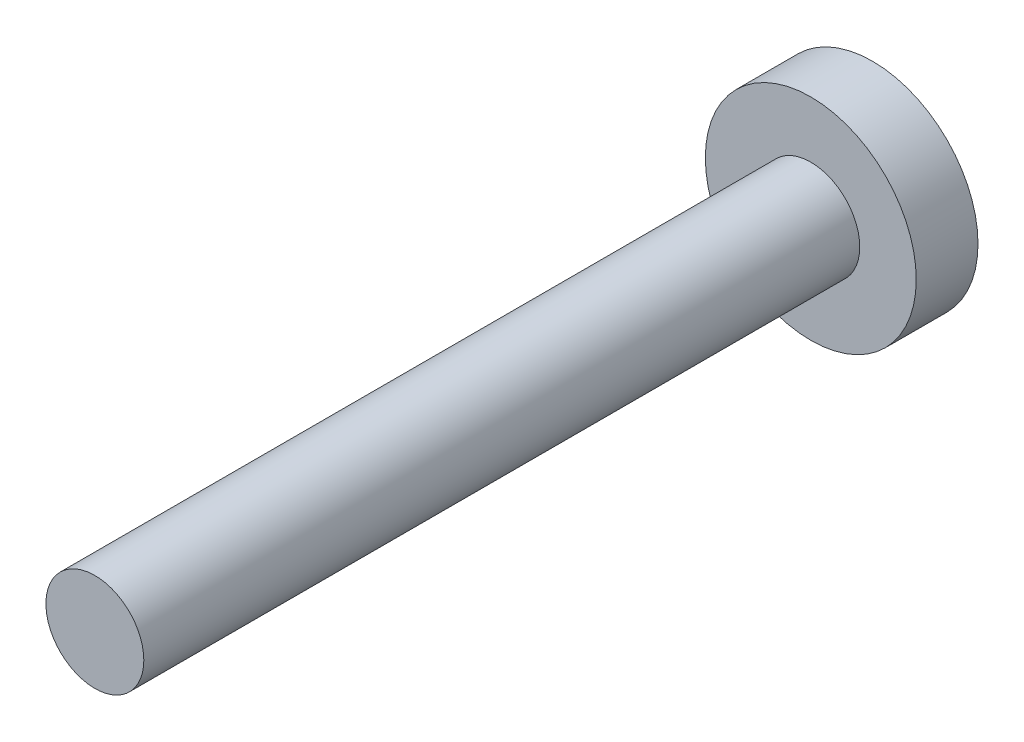
ISO-10303-21;
HEADER;
FILE_DESCRIPTION(('STEP AP214'),'2;1');
FILE_NAME('part.step','',(''),(''),'','','');
FILE_SCHEMA(('AUTOMOTIVE_DESIGN { 1 0 10303 214 1 1 1 1 }'));
ENDSEC;
DATA;
#1=APPLICATION_CONTEXT('core data for automotive mechanical design processes');
#2=APPLICATION_PROTOCOL_DEFINITION('international standard','automotive_design',2000,#1);
#3=PRODUCT_CONTEXT('',#1,'mechanical');
#4=PRODUCT('Part','Part','',(#3));
#5=PRODUCT_RELATED_PRODUCT_CATEGORY('part','',(#4));
#6=PRODUCT_DEFINITION_FORMATION('','',#4);
#7=PRODUCT_DEFINITION_CONTEXT('part definition',#1,'design');
#8=PRODUCT_DEFINITION('design','',#6,#7);
#9=PRODUCT_DEFINITION_SHAPE('','',#8);
#10=(LENGTH_UNIT() NAMED_UNIT(*) SI_UNIT(.MILLI.,.METRE.));
#11=(NAMED_UNIT(*) PLANE_ANGLE_UNIT() SI_UNIT($,.RADIAN.));
#12=(NAMED_UNIT(*) SI_UNIT($,.STERADIAN.) SOLID_ANGLE_UNIT());
#13=UNCERTAINTY_MEASURE_WITH_UNIT(LENGTH_MEASURE(1.E-05),#10,'distance_accuracy_value','');
#14=(GEOMETRIC_REPRESENTATION_CONTEXT(3) GLOBAL_UNCERTAINTY_ASSIGNED_CONTEXT((#13)) GLOBAL_UNIT_ASSIGNED_CONTEXT((#10,
#11,#12)) REPRESENTATION_CONTEXT('',''));
#15=CARTESIAN_POINT('',(0.,0.,0.));
#16=DIRECTION('',(0.,0.,1.));
#17=DIRECTION('',(1.,0.,0.));
#18=AXIS2_PLACEMENT_3D('',#15,#16,#17);
#19=CARTESIAN_POINT('',(0.,0.,3.58));
#20=DIRECTION('',(0.,0.,-1.));
#21=DIRECTION('',(-1.,0.,0.));
#22=AXIS2_PLACEMENT_3D('',#19,#20,#21);
#23=CYLINDRICAL_SURFACE('',#22,6.1125);
#24=CARTESIAN_POINT('',(0.,0.,3.58));
#25=DIRECTION('',(0.,0.,1.));
#26=DIRECTION('',(1.,0.,0.));
#27=AXIS2_PLACEMENT_3D('',#24,#25,#26);
#28=CIRCLE('',#27,6.1125);
#29=CARTESIAN_POINT('',(-6.1125,0.,3.58));
#30=VERTEX_POINT('',#29);
#31=EDGE_CURVE('E51',#30,#30,#28,.T.);
#32=CARTESIAN_POINT('',(0.,0.,0.));
#33=DIRECTION('',(0.,0.,1.));
#34=DIRECTION('',(1.,0.,0.));
#35=AXIS2_PLACEMENT_3D('',#32,#33,#34);
#36=CIRCLE('',#35,6.1125);
#37=CARTESIAN_POINT('',(-6.1125,0.,0.));
#38=VERTEX_POINT('',#37);
#39=EDGE_CURVE('E46',#38,#38,#36,.T.);
#40=CARTESIAN_POINT('',(-6.1125,0.,3.58));
#41=CARTESIAN_POINT('',(-6.1125,0.,3.54270833333333));
#42=CARTESIAN_POINT('',(-6.1125,0.,3.50541666666667));
#43=CARTESIAN_POINT('',(-6.1125,0.,3.43083333333333));
#44=CARTESIAN_POINT('',(-6.1125,0.,3.39354166666667));
#45=CARTESIAN_POINT('',(-6.1125,0.,3.31895833333333));
#46=CARTESIAN_POINT('',(-6.1125,0.,3.28166666666667));
#47=CARTESIAN_POINT('',(-6.1125,0.,3.20708333333333));
#48=CARTESIAN_POINT('',(-6.1125,0.,3.16979166666667));
#49=CARTESIAN_POINT('',(-6.1125,0.,3.09520833333333));
#50=CARTESIAN_POINT('',(-6.1125,0.,3.05791666666667));
#51=CARTESIAN_POINT('',(-6.1125,0.,2.98333333333333));
#52=CARTESIAN_POINT('',(-6.1125,0.,2.94604166666667));
#53=CARTESIAN_POINT('',(-6.1125,0.,2.87145833333333));
#54=CARTESIAN_POINT('',(-6.1125,0.,2.83416666666667));
#55=CARTESIAN_POINT('',(-6.1125,0.,2.75958333333333));
#56=CARTESIAN_POINT('',(-6.1125,0.,2.72229166666667));
#57=CARTESIAN_POINT('',(-6.1125,0.,2.64770833333333));
#58=CARTESIAN_POINT('',(-6.1125,0.,2.61041666666667));
#59=CARTESIAN_POINT('',(-6.1125,0.,2.53583333333333));
#60=CARTESIAN_POINT('',(-6.1125,0.,2.49854166666667));
#61=CARTESIAN_POINT('',(-6.1125,0.,2.42395833333333));
#62=CARTESIAN_POINT('',(-6.1125,0.,2.38666666666667));
#63=CARTESIAN_POINT('',(-6.1125,0.,2.31208333333333));
#64=CARTESIAN_POINT('',(-6.1125,0.,2.27479166666667));
#65=CARTESIAN_POINT('',(-6.1125,0.,2.20020833333333));
#66=CARTESIAN_POINT('',(-6.1125,0.,2.16291666666667));
#67=CARTESIAN_POINT('',(-6.1125,0.,2.08833333333333));
#68=CARTESIAN_POINT('',(-6.1125,0.,2.05104166666667));
#69=CARTESIAN_POINT('',(-6.1125,0.,1.97645833333333));
#70=CARTESIAN_POINT('',(-6.1125,0.,1.93916666666667));
#71=CARTESIAN_POINT('',(-6.1125,0.,1.86458333333333));
#72=CARTESIAN_POINT('',(-6.1125,0.,1.82729166666667));
#73=CARTESIAN_POINT('',(-6.1125,0.,1.75270833333333));
#74=CARTESIAN_POINT('',(-6.1125,0.,1.71541666666667));
#75=CARTESIAN_POINT('',(-6.1125,0.,1.64083333333333));
#76=CARTESIAN_POINT('',(-6.1125,0.,1.60354166666667));
#77=CARTESIAN_POINT('',(-6.1125,0.,1.52895833333333));
#78=CARTESIAN_POINT('',(-6.1125,0.,1.49166666666667));
#79=CARTESIAN_POINT('',(-6.1125,0.,1.41708333333333));
#80=CARTESIAN_POINT('',(-6.1125,0.,1.37979166666667));
#81=CARTESIAN_POINT('',(-6.1125,0.,1.30520833333333));
#82=CARTESIAN_POINT('',(-6.1125,0.,1.26791666666667));
#83=CARTESIAN_POINT('',(-6.1125,0.,1.19333333333333));
#84=CARTESIAN_POINT('',(-6.1125,0.,1.15604166666667));
#85=CARTESIAN_POINT('',(-6.1125,0.,1.08145833333333));
#86=CARTESIAN_POINT('',(-6.1125,0.,1.04416666666667));
#87=CARTESIAN_POINT('',(-6.1125,0.,0.969583333333334));
#88=CARTESIAN_POINT('',(-6.1125,0.,0.932291666666667));
#89=CARTESIAN_POINT('',(-6.1125,0.,0.857708333333333));
#90=CARTESIAN_POINT('',(-6.1125,0.,0.820416666666667));
#91=CARTESIAN_POINT('',(-6.1125,0.,0.745833333333333));
#92=CARTESIAN_POINT('',(-6.1125,0.,0.708541666666667));
#93=CARTESIAN_POINT('',(-6.1125,0.,0.633958333333333));
#94=CARTESIAN_POINT('',(-6.1125,0.,0.596666666666667));
#95=CARTESIAN_POINT('',(-6.1125,0.,0.522083333333333));
#96=CARTESIAN_POINT('',(-6.1125,0.,0.484791666666667));
#97=CARTESIAN_POINT('',(-6.1125,0.,0.410208333333333));
#98=CARTESIAN_POINT('',(-6.1125,0.,0.372916666666667));
#99=CARTESIAN_POINT('',(-6.1125,0.,0.298333333333333));
#100=CARTESIAN_POINT('',(-6.1125,0.,0.261041666666667));
#101=CARTESIAN_POINT('',(-6.1125,0.,0.186458333333333));
#102=CARTESIAN_POINT('',(-6.1125,0.,0.149166666666667));
#103=CARTESIAN_POINT('',(-6.1125,0.,0.0745833333333333));
#104=CARTESIAN_POINT('',(-6.1125,0.,0.0372916666666667));
#105=CARTESIAN_POINT('',(-6.1125,0.,0.));
#106=B_SPLINE_CURVE_WITH_KNOTS('',3,(#40,#41,#42,#43,#44,#45,#46,#47,#48,#49,#50,#51,#52,#53,
#54,#55,#56,#57,#58,#59,#60,#61,#62,#63,#64,#65,#66,#67,#68,#69,#70,#71,#72,#73,#74,#75,#76,#77,
#78,#79,#80,#81,#82,#83,#84,#85,#86,#87,#88,#89,#90,#91,#92,#93,#94,#95,#96,#97,#98,#99,#100,
#101,#102,#103,#104,#105),.UNSPECIFIED.,.F.,.F.,(4,2,2,2,2,2,2,2,2,2,2,2,2,2,2,2,2,2,2,2,2,2,2,
2,2,2,2,2,2,2,2,2,4),(0.,0.111875,0.22375,0.335625,0.4475,0.559375,0.67125,0.783125,0.895,
1.006875,1.11875,1.230625,1.3425,1.454375,1.56625,1.678125,1.79,1.901875,2.01375,2.125625,
2.2375,2.349375,2.46125,2.573125,2.685,2.796875,2.90875,3.020625,3.1325,3.244375,3.35625,
3.468125,3.58),.UNSPECIFIED.);
#107=EDGE_CURVE('BSEAM43',#30,#38,#106,.T.);
#108=ORIENTED_EDGE('',*,*,#31,.F.);
#109=ORIENTED_EDGE('',*,*,#39,.T.);
#110=ORIENTED_EDGE('',*,*,#107,.T.);
#111=ORIENTED_EDGE('',*,*,#107,.F.);
#112=EDGE_LOOP('',(#108,#110,#109,#111));
#113=FACE_BOUND('',#112,.T.);
#114=ADVANCED_FACE('F43',(#113),#23,.T.);
#115=CARTESIAN_POINT('',(0.,0.,3.58));
#116=DIRECTION('',(0.,0.,1.));
#117=DIRECTION('',(1.,0.,0.));
#118=AXIS2_PLACEMENT_3D('',#115,#116,#117);
#119=PLANE('',#118);
#120=CARTESIAN_POINT('',(0.,0.,3.58));
#121=DIRECTION('',(0.,0.,1.));
#122=DIRECTION('',(1.,0.,0.));
#123=AXIS2_PLACEMENT_3D('',#120,#121,#122);
#124=CIRCLE('',#123,2.8375);
#125=CARTESIAN_POINT('',(2.8375,0.,3.58));
#126=VERTEX_POINT('',#125);
#127=EDGE_CURVE('E10',#126,#126,#124,.T.);
#128=ORIENTED_EDGE('',*,*,#127,.F.);
#129=EDGE_LOOP('',(#128));
#130=FACE_BOUND('',#129,.T.);
#131=ORIENTED_EDGE('',*,*,#31,.T.);
#132=EDGE_LOOP('',(#131));
#133=FACE_BOUND('',#132,.T.);
#134=ADVANCED_FACE('F71',(#130,#133),#119,.T.);
#135=CARTESIAN_POINT('',(0.,0.,0.));
#136=DIRECTION('',(0.,0.,1.));
#137=DIRECTION('',(1.,0.,0.));
#138=AXIS2_PLACEMENT_3D('',#135,#136,#137);
#139=PLANE('',#138);
#140=ORIENTED_EDGE('',*,*,#39,.F.);
#141=EDGE_LOOP('',(#140));
#142=FACE_BOUND('',#141,.T.);
#143=ADVANCED_FACE('F68',(#142),#139,.F.);
#144=CARTESIAN_POINT('',(0.,0.,45.08));
#145=DIRECTION('',(0.,0.,-1.));
#146=DIRECTION('',(-1.,0.,0.));
#147=AXIS2_PLACEMENT_3D('',#144,#145,#146);
#148=CYLINDRICAL_SURFACE('',#147,2.8375);
#149=CARTESIAN_POINT('',(0.,0.,45.08));
#150=DIRECTION('',(0.,0.,1.));
#151=DIRECTION('',(1.,0.,0.));
#152=AXIS2_PLACEMENT_3D('',#149,#150,#151);
#153=CIRCLE('',#152,2.8375);
#154=CARTESIAN_POINT('',(2.8375,0.,45.08));
#155=VERTEX_POINT('',#154);
#156=EDGE_CURVE('E58',#155,#155,#153,.T.);
#157=ORIENTED_EDGE('',*,*,#156,.F.);
#158=EDGE_LOOP('',(#157));
#159=FACE_BOUND('',#158,.T.);
#160=ORIENTED_EDGE('',*,*,#127,.T.);
#161=EDGE_LOOP('',(#160));
#162=FACE_BOUND('',#161,.T.);
#163=ADVANCED_FACE('F70',(#159,#162),#148,.T.);
#164=CARTESIAN_POINT('',(0.,0.,45.08));
#165=DIRECTION('',(0.,0.,1.));
#166=DIRECTION('',(1.,0.,0.));
#167=AXIS2_PLACEMENT_3D('',#164,#165,#166);
#168=PLANE('',#167);
#169=ORIENTED_EDGE('',*,*,#156,.T.);
#170=EDGE_LOOP('',(#169));
#171=FACE_BOUND('',#170,.T.);
#172=ADVANCED_FACE('F77',(#171),#168,.T.);
#173=CLOSED_SHELL('',(#114,#134,#143,#163,#172));
#174=MANIFOLD_SOLID_BREP('B2',#173);
#175=ADVANCED_BREP_SHAPE_REPRESENTATION('',(#18,#174),#14);
#176=SHAPE_DEFINITION_REPRESENTATION(#9,#175);
ENDSEC;
END-ISO-10303-21;
